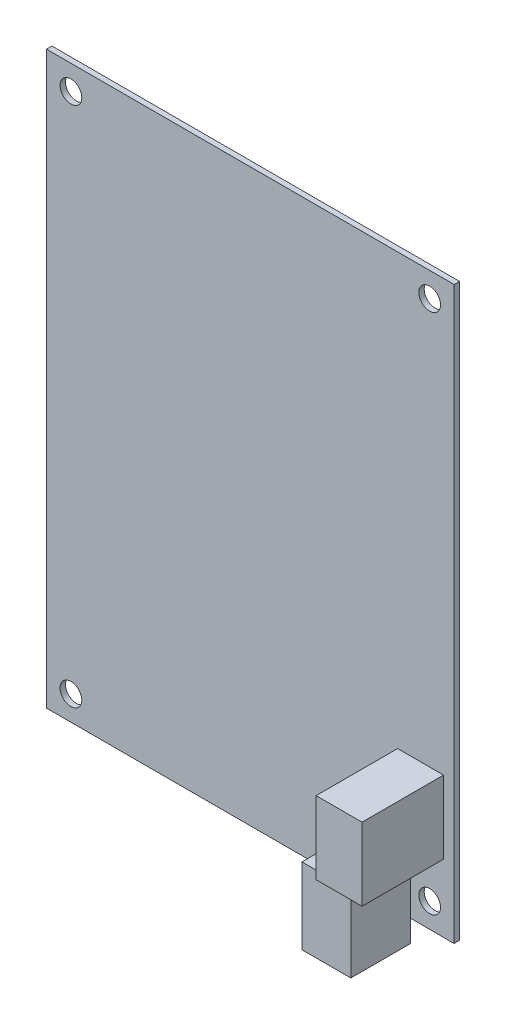
ISO-10303-21;
HEADER;
FILE_DESCRIPTION(('STEP AP214'),'2;1');
FILE_NAME('part.step','',(''),(''),'','','');
FILE_SCHEMA(('AUTOMOTIVE_DESIGN { 1 0 10303 214 1 1 1 1 }'));
ENDSEC;
DATA;
#1=APPLICATION_CONTEXT('core data for automotive mechanical design processes');
#2=APPLICATION_PROTOCOL_DEFINITION('international standard','automotive_design',2000,#1);
#3=PRODUCT_CONTEXT('',#1,'mechanical');
#4=PRODUCT('Part','Part','',(#3));
#5=PRODUCT_RELATED_PRODUCT_CATEGORY('part','',(#4));
#6=PRODUCT_DEFINITION_FORMATION('','',#4);
#7=PRODUCT_DEFINITION_CONTEXT('part definition',#1,'design');
#8=PRODUCT_DEFINITION('design','',#6,#7);
#9=PRODUCT_DEFINITION_SHAPE('','',#8);
#10=(LENGTH_UNIT() NAMED_UNIT(*) SI_UNIT(.MILLI.,.METRE.));
#11=(NAMED_UNIT(*) PLANE_ANGLE_UNIT() SI_UNIT($,.RADIAN.));
#12=(NAMED_UNIT(*) SI_UNIT($,.STERADIAN.) SOLID_ANGLE_UNIT());
#13=UNCERTAINTY_MEASURE_WITH_UNIT(LENGTH_MEASURE(1.E-05),#10,'distance_accuracy_value','');
#14=(GEOMETRIC_REPRESENTATION_CONTEXT(3) GLOBAL_UNCERTAINTY_ASSIGNED_CONTEXT((#13)) GLOBAL_UNIT_ASSIGNED_CONTEXT((#10,
#11,#12)) REPRESENTATION_CONTEXT('',''));
#15=CARTESIAN_POINT('',(0.,0.,0.));
#16=DIRECTION('',(0.,0.,1.));
#17=DIRECTION('',(1.,0.,0.));
#18=AXIS2_PLACEMENT_3D('',#15,#16,#17);
#19=CARTESIAN_POINT('',(0.,0.,1.));
#20=DIRECTION('',(0.,0.,1.));
#21=DIRECTION('',(1.,0.,0.));
#22=AXIS2_PLACEMENT_3D('',#19,#20,#21);
#23=PLANE('',#22);
#24=DIRECTION('',(0.,-1.,0.));
#25=VECTOR('',#24,1.);
#26=CARTESIAN_POINT('',(20.5,-42.5,1.));
#27=LINE('',#26,#25);
#28=CARTESIAN_POINT('',(20.5,-42.5,1.));
#29=VERTEX_POINT('',#28);
#30=CARTESIAN_POINT('',(20.5,-52.5,1.));
#31=VERTEX_POINT('',#30);
#32=EDGE_CURVE('E303',#29,#31,#27,.T.);
#33=ORIENTED_EDGE('',*,*,#32,.F.);
#34=DIRECTION('',(1.,0.,0.));
#35=VECTOR('',#34,1.);
#36=CARTESIAN_POINT('',(29.5,-42.5,1.));
#37=LINE('',#36,#35);
#38=CARTESIAN_POINT('',(29.5,-42.5,1.));
#39=VERTEX_POINT('',#38);
#40=EDGE_CURVE('E255',#29,#39,#37,.T.);
#41=ORIENTED_EDGE('',*,*,#40,.T.);
#42=DIRECTION('',(0.,-1.,0.));
#43=VECTOR('',#42,1.);
#44=CARTESIAN_POINT('',(29.5,-42.5,1.));
#45=LINE('',#44,#43);
#46=CARTESIAN_POINT('',(29.5,-52.5,1.));
#47=VERTEX_POINT('',#46);
#48=EDGE_CURVE('E420',#39,#47,#45,.T.);
#49=ORIENTED_EDGE('',*,*,#48,.T.);
#50=DIRECTION('',(1.,0.,0.));
#51=VECTOR('',#50,1.);
#52=CARTESIAN_POINT('',(-37.5,-52.5,1.));
#53=LINE('',#52,#51);
#54=CARTESIAN_POINT('',(37.5,-52.5,1.));
#55=VERTEX_POINT('',#54);
#56=EDGE_CURVE('E80',#47,#55,#53,.T.);
#57=ORIENTED_EDGE('',*,*,#56,.T.);
#58=DIRECTION('',(0.,1.,0.));
#59=VECTOR('',#58,1.);
#60=CARTESIAN_POINT('',(37.5,52.5,1.));
#61=LINE('',#60,#59);
#62=CARTESIAN_POINT('',(37.5,52.5,1.));
#63=VERTEX_POINT('',#62);
#64=EDGE_CURVE('E376',#55,#63,#61,.T.);
#65=ORIENTED_EDGE('',*,*,#64,.T.);
#66=DIRECTION('',(-1.,0.,0.));
#67=VECTOR('',#66,1.);
#68=CARTESIAN_POINT('',(-37.5,52.5,1.));
#69=LINE('',#68,#67);
#70=CARTESIAN_POINT('',(-37.5,52.5,1.));
#71=VERTEX_POINT('',#70);
#72=EDGE_CURVE('E113',#63,#71,#69,.T.);
#73=ORIENTED_EDGE('',*,*,#72,.T.);
#74=DIRECTION('',(0.,-1.,0.));
#75=VECTOR('',#74,1.);
#76=CARTESIAN_POINT('',(-37.5,52.5,1.));
#77=LINE('',#76,#75);
#78=CARTESIAN_POINT('',(-37.5,-52.5,1.));
#79=VERTEX_POINT('',#78);
#80=EDGE_CURVE('E397',#71,#79,#77,.T.);
#81=ORIENTED_EDGE('',*,*,#80,.T.);
#82=EDGE_CURVE('E402',#79,#31,#53,.T.);
#83=ORIENTED_EDGE('',*,*,#82,.T.);
#84=EDGE_LOOP('',(#33,#41,#49,#57,#65,#73,#81,#83));
#85=FACE_BOUND('',#84,.T.);
#86=CARTESIAN_POINT('',(33.,48.,1.));
#87=DIRECTION('',(0.,0.,1.));
#88=DIRECTION('',(-1.,0.,0.));
#89=AXIS2_PLACEMENT_3D('',#86,#87,#88);
#90=CIRCLE('',#89,2.);
#91=CARTESIAN_POINT('',(31.,48.,1.));
#92=VERTEX_POINT('',#91);
#93=EDGE_CURVE('E414',#92,#92,#90,.T.);
#94=ORIENTED_EDGE('',*,*,#93,.F.);
#95=EDGE_LOOP('',(#94));
#96=FACE_BOUND('',#95,.T.);
#97=CARTESIAN_POINT('',(-33.,48.,1.));
#98=DIRECTION('',(0.,0.,-1.));
#99=DIRECTION('',(1.,0.,0.));
#100=AXIS2_PLACEMENT_3D('',#97,#98,#99);
#101=CIRCLE('',#100,2.);
#102=CARTESIAN_POINT('',(-31.,48.,1.));
#103=VERTEX_POINT('',#102);
#104=EDGE_CURVE('E429',#103,#103,#101,.T.);
#105=ORIENTED_EDGE('',*,*,#104,.T.);
#106=EDGE_LOOP('',(#105));
#107=FACE_BOUND('',#106,.T.);
#108=CARTESIAN_POINT('',(33.,-48.,1.));
#109=DIRECTION('',(0.,0.,-1.));
#110=DIRECTION('',(-1.,0.,0.));
#111=AXIS2_PLACEMENT_3D('',#108,#109,#110);
#112=CIRCLE('',#111,2.);
#113=CARTESIAN_POINT('',(31.,-48.,1.));
#114=VERTEX_POINT('',#113);
#115=EDGE_CURVE('E439',#114,#114,#112,.T.);
#116=ORIENTED_EDGE('',*,*,#115,.T.);
#117=EDGE_LOOP('',(#116));
#118=FACE_BOUND('',#117,.T.);
#119=CARTESIAN_POINT('',(-33.,-48.,1.));
#120=DIRECTION('',(0.,0.,1.));
#121=DIRECTION('',(1.,0.,0.));
#122=AXIS2_PLACEMENT_3D('',#119,#120,#121);
#123=CIRCLE('',#122,2.);
#124=CARTESIAN_POINT('',(-31.,-48.,1.));
#125=VERTEX_POINT('',#124);
#126=EDGE_CURVE('E450',#125,#125,#123,.T.);
#127=ORIENTED_EDGE('',*,*,#126,.F.);
#128=EDGE_LOOP('',(#127));
#129=FACE_BOUND('',#128,.T.);
#130=DIRECTION('',(0.,1.,0.));
#131=VECTOR('',#130,1.);
#132=CARTESIAN_POINT('',(35.5617368341224,-40.0335167486018,1.));
#133=LINE('',#132,#131);
#134=CARTESIAN_POINT('',(35.5617368341224,-40.0335167486018,1.));
#135=VERTEX_POINT('',#134);
#136=CARTESIAN_POINT('',(35.5617368341224,-26.6380643088427,1.));
#137=VERTEX_POINT('',#136);
#138=EDGE_CURVE('E335',#135,#137,#133,.T.);
#139=ORIENTED_EDGE('',*,*,#138,.F.);
#140=DIRECTION('',(1.,0.,0.));
#141=VECTOR('',#140,1.);
#142=CARTESIAN_POINT('',(27.109844223322,-40.0335167486018,1.));
#143=LINE('',#142,#141);
#144=CARTESIAN_POINT('',(27.109844223322,-40.0335167486018,1.));
#145=VERTEX_POINT('',#144);
#146=EDGE_CURVE('E204',#145,#135,#143,.T.);
#147=ORIENTED_EDGE('',*,*,#146,.F.);
#148=DIRECTION('',(0.,-1.,0.));
#149=VECTOR('',#148,1.);
#150=CARTESIAN_POINT('',(27.109844223322,-26.6380643088427,1.));
#151=LINE('',#150,#149);
#152=CARTESIAN_POINT('',(27.109844223322,-26.6380643088427,1.));
#153=VERTEX_POINT('',#152);
#154=EDGE_CURVE('E201',#153,#145,#151,.T.);
#155=ORIENTED_EDGE('',*,*,#154,.F.);
#156=DIRECTION('',(-1.,0.,0.));
#157=VECTOR('',#156,1.);
#158=CARTESIAN_POINT('',(35.5617368341224,-26.6380643088427,1.));
#159=LINE('',#158,#157);
#160=EDGE_CURVE('E349',#137,#153,#159,.T.);
#161=ORIENTED_EDGE('',*,*,#160,.F.);
#162=EDGE_LOOP('',(#139,#147,#155,#161));
#163=FACE_BOUND('',#162,.T.);
#164=ADVANCED_FACE('F47',(#85,#96,#107,#118,#129,#163),#23,.T.);
#165=CARTESIAN_POINT('',(-37.5,-52.5,1.));
#166=DIRECTION('',(0.,1.,0.));
#167=DIRECTION('',(0.,0.,1.));
#168=AXIS2_PLACEMENT_3D('',#165,#166,#167);
#169=PLANE('',#168);
#170=DIRECTION('',(1.,0.,0.));
#171=VECTOR('',#170,1.);
#172=CARTESIAN_POINT('',(29.5,-52.5,1.));
#173=LINE('',#172,#171);
#174=EDGE_CURVE('E207',#31,#47,#173,.T.);
#175=ORIENTED_EDGE('',*,*,#174,.F.);
#176=ORIENTED_EDGE('',*,*,#82,.F.);
#177=DIRECTION('',(0.,0.,-1.));
#178=VECTOR('',#177,1.);
#179=CARTESIAN_POINT('',(-37.5,-52.5,1.));
#180=LINE('',#179,#178);
#181=CARTESIAN_POINT('',(-37.5,-52.5,0.));
#182=VERTEX_POINT('',#181);
#183=EDGE_CURVE('E359',#79,#182,#180,.T.);
#184=ORIENTED_EDGE('',*,*,#183,.T.);
#185=DIRECTION('',(1.,0.,0.));
#186=VECTOR('',#185,1.);
#187=CARTESIAN_POINT('',(-37.5,-52.5,0.));
#188=LINE('',#187,#186);
#189=CARTESIAN_POINT('',(37.5,-52.5,0.));
#190=VERTEX_POINT('',#189);
#191=EDGE_CURVE('E105',#182,#190,#188,.T.);
#192=ORIENTED_EDGE('',*,*,#191,.T.);
#193=DIRECTION('',(0.,0.,-1.));
#194=VECTOR('',#193,1.);
#195=CARTESIAN_POINT('',(37.5,-52.5,1.));
#196=LINE('',#195,#194);
#197=EDGE_CURVE('E363',#55,#190,#196,.T.);
#198=ORIENTED_EDGE('',*,*,#197,.F.);
#199=ORIENTED_EDGE('',*,*,#56,.F.);
#200=EDGE_LOOP('',(#175,#176,#184,#192,#198,#199));
#201=FACE_BOUND('',#200,.T.);
#202=ADVANCED_FACE('F508',(#201),#169,.F.);
#203=CARTESIAN_POINT('',(37.5,52.5,1.));
#204=DIRECTION('',(-1.,0.,0.));
#205=DIRECTION('',(0.,-1.,0.));
#206=AXIS2_PLACEMENT_3D('',#203,#204,#205);
#207=PLANE('',#206);
#208=DIRECTION('',(0.,1.,0.));
#209=VECTOR('',#208,1.);
#210=CARTESIAN_POINT('',(37.5,52.5,0.));
#211=LINE('',#210,#209);
#212=CARTESIAN_POINT('',(37.5,52.5,0.));
#213=VERTEX_POINT('',#212);
#214=EDGE_CURVE('E462',#190,#213,#211,.T.);
#215=ORIENTED_EDGE('',*,*,#214,.T.);
#216=DIRECTION('',(0.,0.,-1.));
#217=VECTOR('',#216,1.);
#218=CARTESIAN_POINT('',(37.5,52.5,1.));
#219=LINE('',#218,#217);
#220=EDGE_CURVE('E12',#63,#213,#219,.T.);
#221=ORIENTED_EDGE('',*,*,#220,.F.);
#222=ORIENTED_EDGE('',*,*,#64,.F.);
#223=ORIENTED_EDGE('',*,*,#197,.T.);
#224=EDGE_LOOP('',(#215,#221,#222,#223));
#225=FACE_BOUND('',#224,.T.);
#226=ADVANCED_FACE('F50',(#225),#207,.F.);
#227=CARTESIAN_POINT('',(-37.5,52.5,1.));
#228=DIRECTION('',(0.,-1.,0.));
#229=DIRECTION('',(0.,0.,-1.));
#230=AXIS2_PLACEMENT_3D('',#227,#228,#229);
#231=PLANE('',#230);
#232=DIRECTION('',(-1.,0.,0.));
#233=VECTOR('',#232,1.);
#234=CARTESIAN_POINT('',(-37.5,52.5,0.));
#235=LINE('',#234,#233);
#236=CARTESIAN_POINT('',(-37.5,52.5,0.));
#237=VERTEX_POINT('',#236);
#238=EDGE_CURVE('E382',#213,#237,#235,.T.);
#239=ORIENTED_EDGE('',*,*,#238,.T.);
#240=DIRECTION('',(0.,0.,-1.));
#241=VECTOR('',#240,1.);
#242=CARTESIAN_POINT('',(-37.5,52.5,1.));
#243=LINE('',#242,#241);
#244=EDGE_CURVE('E58',#71,#237,#243,.T.);
#245=ORIENTED_EDGE('',*,*,#244,.F.);
#246=ORIENTED_EDGE('',*,*,#72,.F.);
#247=ORIENTED_EDGE('',*,*,#220,.T.);
#248=EDGE_LOOP('',(#239,#245,#246,#247));
#249=FACE_BOUND('',#248,.T.);
#250=ADVANCED_FACE('F482',(#249),#231,.F.);
#251=CARTESIAN_POINT('',(-37.5,52.5,1.));
#252=DIRECTION('',(1.,0.,0.));
#253=DIRECTION('',(0.,1.,0.));
#254=AXIS2_PLACEMENT_3D('',#251,#252,#253);
#255=PLANE('',#254);
#256=DIRECTION('',(0.,-1.,0.));
#257=VECTOR('',#256,1.);
#258=CARTESIAN_POINT('',(-37.5,52.5,0.));
#259=LINE('',#258,#257);
#260=EDGE_CURVE('E377',#237,#182,#259,.T.);
#261=ORIENTED_EDGE('',*,*,#260,.T.);
#262=ORIENTED_EDGE('',*,*,#183,.F.);
#263=ORIENTED_EDGE('',*,*,#80,.F.);
#264=ORIENTED_EDGE('',*,*,#244,.T.);
#265=EDGE_LOOP('',(#261,#262,#263,#264));
#266=FACE_BOUND('',#265,.T.);
#267=ADVANCED_FACE('F487',(#266),#255,.F.);
#268=CARTESIAN_POINT('',(0.,0.,0.));
#269=DIRECTION('',(0.,0.,1.));
#270=DIRECTION('',(1.,0.,0.));
#271=AXIS2_PLACEMENT_3D('',#268,#269,#270);
#272=PLANE('',#271);
#273=CARTESIAN_POINT('',(33.,48.,0.));
#274=DIRECTION('',(0.,0.,1.));
#275=DIRECTION('',(1.,0.,0.));
#276=AXIS2_PLACEMENT_3D('',#273,#274,#275);
#277=CIRCLE('',#276,2.);
#278=CARTESIAN_POINT('',(35.,48.,0.));
#279=VERTEX_POINT('',#278);
#280=EDGE_CURVE('E419',#279,#279,#277,.F.);
#281=ORIENTED_EDGE('',*,*,#280,.F.);
#282=EDGE_LOOP('',(#281));
#283=FACE_BOUND('',#282,.T.);
#284=CARTESIAN_POINT('',(-33.,48.,0.));
#285=DIRECTION('',(0.,0.,1.));
#286=DIRECTION('',(1.,0.,0.));
#287=AXIS2_PLACEMENT_3D('',#284,#285,#286);
#288=CIRCLE('',#287,2.);
#289=CARTESIAN_POINT('',(-31.,48.,0.));
#290=VERTEX_POINT('',#289);
#291=EDGE_CURVE('E434',#290,#290,#288,.T.);
#292=ORIENTED_EDGE('',*,*,#291,.T.);
#293=EDGE_LOOP('',(#292));
#294=FACE_BOUND('',#293,.T.);
#295=CARTESIAN_POINT('',(33.,-48.,0.));
#296=DIRECTION('',(0.,0.,1.));
#297=DIRECTION('',(1.,0.,0.));
#298=AXIS2_PLACEMENT_3D('',#295,#296,#297);
#299=CIRCLE('',#298,2.);
#300=CARTESIAN_POINT('',(35.,-48.,0.));
#301=VERTEX_POINT('',#300);
#302=EDGE_CURVE('E433',#301,#301,#299,.T.);
#303=ORIENTED_EDGE('',*,*,#302,.T.);
#304=EDGE_LOOP('',(#303));
#305=FACE_BOUND('',#304,.T.);
#306=CARTESIAN_POINT('',(-33.,-48.,0.));
#307=DIRECTION('',(0.,0.,1.));
#308=DIRECTION('',(1.,0.,0.));
#309=AXIS2_PLACEMENT_3D('',#306,#307,#308);
#310=CIRCLE('',#309,2.);
#311=CARTESIAN_POINT('',(-31.,-48.,0.));
#312=VERTEX_POINT('',#311);
#313=EDGE_CURVE('E457',#312,#312,#310,.F.);
#314=ORIENTED_EDGE('',*,*,#313,.F.);
#315=EDGE_LOOP('',(#314));
#316=FACE_BOUND('',#315,.T.);
#317=ORIENTED_EDGE('',*,*,#214,.F.);
#318=ORIENTED_EDGE('',*,*,#191,.F.);
#319=ORIENTED_EDGE('',*,*,#260,.F.);
#320=ORIENTED_EDGE('',*,*,#238,.F.);
#321=EDGE_LOOP('',(#317,#318,#319,#320));
#322=FACE_BOUND('',#321,.T.);
#323=ADVANCED_FACE('F489',(#283,#294,#305,#316,#322),#272,.F.);
#324=CARTESIAN_POINT('',(-33.,-48.,-0.000999999999999916));
#325=DIRECTION('',(0.,0.,1.));
#326=DIRECTION('',(1.,0.,0.));
#327=AXIS2_PLACEMENT_3D('',#324,#325,#326);
#328=CYLINDRICAL_SURFACE('',#327,2.);
#329=ORIENTED_EDGE('',*,*,#126,.T.);
#330=EDGE_LOOP('',(#329));
#331=FACE_BOUND('',#330,.T.);
#332=ORIENTED_EDGE('',*,*,#313,.T.);
#333=EDGE_LOOP('',(#332));
#334=FACE_BOUND('',#333,.T.);
#335=ADVANCED_FACE('F491',(#331,#334),#328,.F.);
#336=CARTESIAN_POINT('',(33.,-48.,-0.000999999999999916));
#337=DIRECTION('',(0.,0.,1.));
#338=DIRECTION('',(1.,0.,0.));
#339=AXIS2_PLACEMENT_3D('',#336,#337,#338);
#340=CYLINDRICAL_SURFACE('',#339,2.);
#341=ORIENTED_EDGE('',*,*,#115,.F.);
#342=EDGE_LOOP('',(#341));
#343=FACE_BOUND('',#342,.T.);
#344=ORIENTED_EDGE('',*,*,#302,.F.);
#345=EDGE_LOOP('',(#344));
#346=FACE_BOUND('',#345,.T.);
#347=ADVANCED_FACE('F498',(#343,#346),#340,.F.);
#348=CARTESIAN_POINT('',(-33.,48.,-0.000999999999999916));
#349=DIRECTION('',(0.,0.,1.));
#350=DIRECTION('',(1.,0.,0.));
#351=AXIS2_PLACEMENT_3D('',#348,#349,#350);
#352=CYLINDRICAL_SURFACE('',#351,2.);
#353=ORIENTED_EDGE('',*,*,#104,.F.);
#354=EDGE_LOOP('',(#353));
#355=FACE_BOUND('',#354,.T.);
#356=ORIENTED_EDGE('',*,*,#291,.F.);
#357=EDGE_LOOP('',(#356));
#358=FACE_BOUND('',#357,.T.);
#359=ADVANCED_FACE('F521',(#355,#358),#352,.F.);
#360=CARTESIAN_POINT('',(33.,48.,-0.000999999999999916));
#361=DIRECTION('',(0.,0.,1.));
#362=DIRECTION('',(1.,0.,0.));
#363=AXIS2_PLACEMENT_3D('',#360,#361,#362);
#364=CYLINDRICAL_SURFACE('',#363,2.);
#365=ORIENTED_EDGE('',*,*,#93,.T.);
#366=EDGE_LOOP('',(#365));
#367=FACE_BOUND('',#366,.T.);
#368=ORIENTED_EDGE('',*,*,#280,.T.);
#369=EDGE_LOOP('',(#368));
#370=FACE_BOUND('',#369,.T.);
#371=ADVANCED_FACE('F527',(#367,#370),#364,.F.);
#372=CARTESIAN_POINT('',(20.5,-42.5,1.));
#373=DIRECTION('',(-1.,0.,0.));
#374=DIRECTION('',(0.,0.,1.));
#375=AXIS2_PLACEMENT_3D('',#372,#373,#374);
#376=PLANE('',#375);
#377=ORIENTED_EDGE('',*,*,#32,.T.);
#378=DIRECTION('',(0.,1.,0.));
#379=VECTOR('',#378,1.);
#380=CARTESIAN_POINT('',(20.5,-56.5,1.));
#381=LINE('',#380,#379);
#382=CARTESIAN_POINT('',(20.5,-56.5,1.));
#383=VERTEX_POINT('',#382);
#384=EDGE_CURVE('E279',#383,#31,#381,.T.);
#385=ORIENTED_EDGE('',*,*,#384,.F.);
#386=DIRECTION('',(0.,0.,-1.));
#387=VECTOR('',#386,1.);
#388=CARTESIAN_POINT('',(20.5,-56.5,1.));
#389=LINE('',#388,#387);
#390=CARTESIAN_POINT('',(20.5,-56.5,12.));
#391=VERTEX_POINT('',#390);
#392=EDGE_CURVE('E313',#391,#383,#389,.T.);
#393=ORIENTED_EDGE('',*,*,#392,.F.);
#394=DIRECTION('',(0.,-1.,0.));
#395=VECTOR('',#394,1.);
#396=CARTESIAN_POINT('',(20.5,-42.5,12.));
#397=LINE('',#396,#395);
#398=CARTESIAN_POINT('',(20.5,-42.5,12.));
#399=VERTEX_POINT('',#398);
#400=EDGE_CURVE('E300',#399,#391,#397,.T.);
#401=ORIENTED_EDGE('',*,*,#400,.F.);
#402=DIRECTION('',(0.,0.,-1.));
#403=VECTOR('',#402,1.);
#404=CARTESIAN_POINT('',(20.5,-42.5,1.));
#405=LINE('',#404,#403);
#406=EDGE_CURVE('E263',#399,#29,#405,.T.);
#407=ORIENTED_EDGE('',*,*,#406,.T.);
#408=EDGE_LOOP('',(#377,#385,#393,#401,#407));
#409=FACE_BOUND('',#408,.T.);
#410=ADVANCED_FACE('F533',(#409),#376,.T.);
#411=CARTESIAN_POINT('',(20.5,-42.5,12.));
#412=DIRECTION('',(0.,0.,1.));
#413=DIRECTION('',(1.,0.,0.));
#414=AXIS2_PLACEMENT_3D('',#411,#412,#413);
#415=PLANE('',#414);
#416=ORIENTED_EDGE('',*,*,#400,.T.);
#417=DIRECTION('',(-1.,0.,0.));
#418=VECTOR('',#417,1.);
#419=CARTESIAN_POINT('',(20.5,-56.5,12.));
#420=LINE('',#419,#418);
#421=CARTESIAN_POINT('',(29.5,-56.5,12.));
#422=VERTEX_POINT('',#421);
#423=EDGE_CURVE('E237',#422,#391,#420,.T.);
#424=ORIENTED_EDGE('',*,*,#423,.F.);
#425=DIRECTION('',(0.,-1.,0.));
#426=VECTOR('',#425,1.);
#427=CARTESIAN_POINT('',(29.5,-42.5,12.));
#428=LINE('',#427,#426);
#429=CARTESIAN_POINT('',(29.5,-42.5,12.));
#430=VERTEX_POINT('',#429);
#431=EDGE_CURVE('E304',#430,#422,#428,.T.);
#432=ORIENTED_EDGE('',*,*,#431,.F.);
#433=DIRECTION('',(-1.,0.,0.));
#434=VECTOR('',#433,1.);
#435=CARTESIAN_POINT('',(20.5,-42.5,12.));
#436=LINE('',#435,#434);
#437=EDGE_CURVE('E254',#430,#399,#436,.T.);
#438=ORIENTED_EDGE('',*,*,#437,.T.);
#439=EDGE_LOOP('',(#416,#424,#432,#438));
#440=FACE_BOUND('',#439,.T.);
#441=ADVANCED_FACE('F542',(#440),#415,.T.);
#442=CARTESIAN_POINT('',(29.5,-42.5,12.));
#443=DIRECTION('',(1.,0.,0.));
#444=DIRECTION('',(0.,0.,-1.));
#445=AXIS2_PLACEMENT_3D('',#442,#443,#444);
#446=PLANE('',#445);
#447=ORIENTED_EDGE('',*,*,#431,.T.);
#448=DIRECTION('',(0.,0.,1.));
#449=VECTOR('',#448,1.);
#450=CARTESIAN_POINT('',(29.5,-56.5,12.));
#451=LINE('',#450,#449);
#452=CARTESIAN_POINT('',(29.5,-56.5,1.));
#453=VERTEX_POINT('',#452);
#454=EDGE_CURVE('E232',#453,#422,#451,.T.);
#455=ORIENTED_EDGE('',*,*,#454,.F.);
#456=DIRECTION('',(0.,1.,0.));
#457=VECTOR('',#456,1.);
#458=CARTESIAN_POINT('',(29.5,-56.5,1.));
#459=LINE('',#458,#457);
#460=EDGE_CURVE('E274',#453,#47,#459,.T.);
#461=ORIENTED_EDGE('',*,*,#460,.T.);
#462=ORIENTED_EDGE('',*,*,#48,.F.);
#463=DIRECTION('',(0.,0.,1.));
#464=VECTOR('',#463,1.);
#465=CARTESIAN_POINT('',(29.5,-42.5,12.));
#466=LINE('',#465,#464);
#467=EDGE_CURVE('E248',#39,#430,#466,.T.);
#468=ORIENTED_EDGE('',*,*,#467,.T.);
#469=EDGE_LOOP('',(#447,#455,#461,#462,#468));
#470=FACE_BOUND('',#469,.T.);
#471=ADVANCED_FACE('F536',(#470),#446,.T.);
#472=CARTESIAN_POINT('',(0.,-42.5,0.));
#473=DIRECTION('',(0.,1.,0.));
#474=DIRECTION('',(0.,0.,1.));
#475=AXIS2_PLACEMENT_3D('',#472,#473,#474);
#476=PLANE('',#475);
#477=ORIENTED_EDGE('',*,*,#40,.F.);
#478=ORIENTED_EDGE('',*,*,#406,.F.);
#479=ORIENTED_EDGE('',*,*,#437,.F.);
#480=ORIENTED_EDGE('',*,*,#467,.F.);
#481=EDGE_LOOP('',(#477,#478,#479,#480));
#482=FACE_BOUND('',#481,.T.);
#483=ADVANCED_FACE('F541',(#482),#476,.T.);
#484=CARTESIAN_POINT('',(29.5,-56.5,1.));
#485=DIRECTION('',(0.,0.,1.));
#486=DIRECTION('',(1.,0.,0.));
#487=AXIS2_PLACEMENT_3D('',#484,#485,#486);
#488=PLANE('',#487);
#489=ORIENTED_EDGE('',*,*,#174,.T.);
#490=ORIENTED_EDGE('',*,*,#460,.F.);
#491=DIRECTION('',(1.,0.,0.));
#492=VECTOR('',#491,1.);
#493=CARTESIAN_POINT('',(29.5,-56.5,1.));
#494=LINE('',#493,#492);
#495=EDGE_CURVE('E211',#383,#453,#494,.T.);
#496=ORIENTED_EDGE('',*,*,#495,.F.);
#497=ORIENTED_EDGE('',*,*,#384,.T.);
#498=EDGE_LOOP('',(#489,#490,#496,#497));
#499=FACE_BOUND('',#498,.T.);
#500=ADVANCED_FACE('F555',(#499),#488,.F.);
#501=CARTESIAN_POINT('',(0.,-56.5,0.));
#502=DIRECTION('',(0.,1.,0.));
#503=DIRECTION('',(0.,0.,1.));
#504=AXIS2_PLACEMENT_3D('',#501,#502,#503);
#505=PLANE('',#504);
#506=ORIENTED_EDGE('',*,*,#495,.T.);
#507=ORIENTED_EDGE('',*,*,#454,.T.);
#508=ORIENTED_EDGE('',*,*,#423,.T.);
#509=ORIENTED_EDGE('',*,*,#392,.T.);
#510=EDGE_LOOP('',(#506,#507,#508,#509));
#511=FACE_BOUND('',#510,.T.);
#512=ADVANCED_FACE('F559',(#511),#505,.F.);
#513=CARTESIAN_POINT('',(27.109844223322,-40.0335167486018,16.));
#514=DIRECTION('',(0.,1.,0.));
#515=DIRECTION('',(0.,0.,1.));
#516=AXIS2_PLACEMENT_3D('',#513,#514,#515);
#517=PLANE('',#516);
#518=ORIENTED_EDGE('',*,*,#146,.T.);
#519=DIRECTION('',(0.,0.,-1.));
#520=VECTOR('',#519,1.);
#521=CARTESIAN_POINT('',(35.5617368341224,-40.0335167486018,16.));
#522=LINE('',#521,#520);
#523=CARTESIAN_POINT('',(35.5617368341224,-40.0335167486018,16.));
#524=VERTEX_POINT('',#523);
#525=EDGE_CURVE('E184',#524,#135,#522,.T.);
#526=ORIENTED_EDGE('',*,*,#525,.F.);
#527=DIRECTION('',(1.,0.,0.));
#528=VECTOR('',#527,1.);
#529=CARTESIAN_POINT('',(27.109844223322,-40.0335167486018,16.));
#530=LINE('',#529,#528);
#531=CARTESIAN_POINT('',(27.109844223322,-40.0335167486018,16.));
#532=VERTEX_POINT('',#531);
#533=EDGE_CURVE('E192',#532,#524,#530,.T.);
#534=ORIENTED_EDGE('',*,*,#533,.F.);
#535=DIRECTION('',(0.,0.,-1.));
#536=VECTOR('',#535,1.);
#537=CARTESIAN_POINT('',(27.109844223322,-40.0335167486018,16.));
#538=LINE('',#537,#536);
#539=EDGE_CURVE('E291',#532,#145,#538,.T.);
#540=ORIENTED_EDGE('',*,*,#539,.T.);
#541=EDGE_LOOP('',(#518,#526,#534,#540));
#542=FACE_BOUND('',#541,.T.);
#543=ADVANCED_FACE('F202',(#542),#517,.F.);
#544=CARTESIAN_POINT('',(35.5617368341224,-40.0335167486018,16.));
#545=DIRECTION('',(-1.,0.,0.));
#546=DIRECTION('',(0.,0.,1.));
#547=AXIS2_PLACEMENT_3D('',#544,#545,#546);
#548=PLANE('',#547);
#549=ORIENTED_EDGE('',*,*,#138,.T.);
#550=DIRECTION('',(0.,0.,-1.));
#551=VECTOR('',#550,1.);
#552=CARTESIAN_POINT('',(35.5617368341224,-26.6380643088427,16.));
#553=LINE('',#552,#551);
#554=CARTESIAN_POINT('',(35.5617368341224,-26.6380643088427,16.));
#555=VERTEX_POINT('',#554);
#556=EDGE_CURVE('E187',#555,#137,#553,.T.);
#557=ORIENTED_EDGE('',*,*,#556,.F.);
#558=DIRECTION('',(0.,1.,0.));
#559=VECTOR('',#558,1.);
#560=CARTESIAN_POINT('',(35.5617368341224,-40.0335167486018,16.));
#561=LINE('',#560,#559);
#562=EDGE_CURVE('E180',#524,#555,#561,.T.);
#563=ORIENTED_EDGE('',*,*,#562,.F.);
#564=ORIENTED_EDGE('',*,*,#525,.T.);
#565=EDGE_LOOP('',(#549,#557,#563,#564));
#566=FACE_BOUND('',#565,.T.);
#567=ADVANCED_FACE('F182',(#566),#548,.F.);
#568=CARTESIAN_POINT('',(35.5617368341224,-26.6380643088427,16.));
#569=DIRECTION('',(0.,-1.,0.));
#570=DIRECTION('',(0.,0.,-1.));
#571=AXIS2_PLACEMENT_3D('',#568,#569,#570);
#572=PLANE('',#571);
#573=ORIENTED_EDGE('',*,*,#160,.T.);
#574=DIRECTION('',(0.,0.,-1.));
#575=VECTOR('',#574,1.);
#576=CARTESIAN_POINT('',(27.109844223322,-26.6380643088427,16.));
#577=LINE('',#576,#575);
#578=CARTESIAN_POINT('',(27.109844223322,-26.6380643088427,16.));
#579=VERTEX_POINT('',#578);
#580=EDGE_CURVE('E68',#579,#153,#577,.T.);
#581=ORIENTED_EDGE('',*,*,#580,.F.);
#582=DIRECTION('',(-1.,0.,0.));
#583=VECTOR('',#582,1.);
#584=CARTESIAN_POINT('',(35.5617368341224,-26.6380643088427,16.));
#585=LINE('',#584,#583);
#586=EDGE_CURVE('E191',#555,#579,#585,.T.);
#587=ORIENTED_EDGE('',*,*,#586,.F.);
#588=ORIENTED_EDGE('',*,*,#556,.T.);
#589=EDGE_LOOP('',(#573,#581,#587,#588));
#590=FACE_BOUND('',#589,.T.);
#591=ADVANCED_FACE('F570',(#590),#572,.F.);
#592=CARTESIAN_POINT('',(27.109844223322,-26.6380643088427,16.));
#593=DIRECTION('',(1.,0.,0.));
#594=DIRECTION('',(0.,0.,-1.));
#595=AXIS2_PLACEMENT_3D('',#592,#593,#594);
#596=PLANE('',#595);
#597=ORIENTED_EDGE('',*,*,#154,.T.);
#598=ORIENTED_EDGE('',*,*,#539,.F.);
#599=DIRECTION('',(0.,-1.,0.));
#600=VECTOR('',#599,1.);
#601=CARTESIAN_POINT('',(27.109844223322,-26.6380643088427,16.));
#602=LINE('',#601,#600);
#603=EDGE_CURVE('E196',#579,#532,#602,.T.);
#604=ORIENTED_EDGE('',*,*,#603,.F.);
#605=ORIENTED_EDGE('',*,*,#580,.T.);
#606=EDGE_LOOP('',(#597,#598,#604,#605));
#607=FACE_BOUND('',#606,.T.);
#608=ADVANCED_FACE('F573',(#607),#596,.F.);
#609=CARTESIAN_POINT('',(0.,0.,16.));
#610=DIRECTION('',(0.,0.,1.));
#611=DIRECTION('',(1.,0.,0.));
#612=AXIS2_PLACEMENT_3D('',#609,#610,#611);
#613=PLANE('',#612);
#614=ORIENTED_EDGE('',*,*,#533,.T.);
#615=ORIENTED_EDGE('',*,*,#562,.T.);
#616=ORIENTED_EDGE('',*,*,#586,.T.);
#617=ORIENTED_EDGE('',*,*,#603,.T.);
#618=EDGE_LOOP('',(#614,#615,#616,#617));
#619=FACE_BOUND('',#618,.T.);
#620=ADVANCED_FACE('F195',(#619),#613,.T.);
#621=CLOSED_SHELL('',(#164,#202,#226,#250,#267,#323,#335,#347,#359,#371,#410,#441,#471,#483,
#500,#512,#543,#567,#591,#608,#620));
#622=MANIFOLD_SOLID_BREP('B2',#621);
#623=ADVANCED_BREP_SHAPE_REPRESENTATION('',(#18,#622),#14);
#624=SHAPE_DEFINITION_REPRESENTATION(#9,#623);
ENDSEC;
END-ISO-10303-21;
